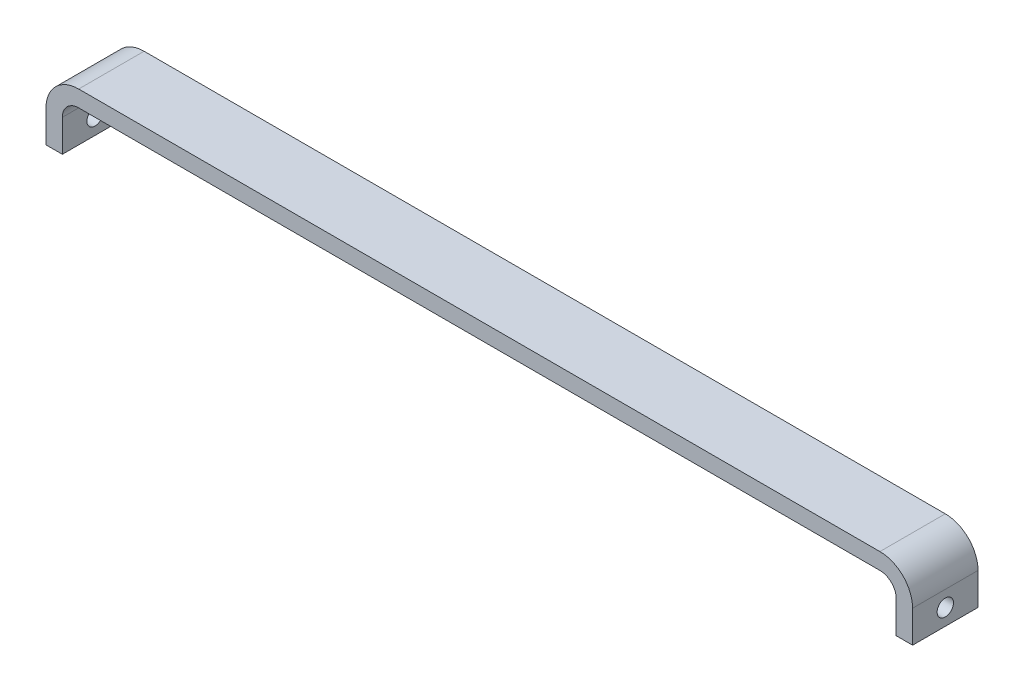
ISO-10303-21;
HEADER;
FILE_DESCRIPTION(('STEP AP214'),'2;1');
FILE_NAME('part.step','',(''),(''),'','','');
FILE_SCHEMA(('AUTOMOTIVE_DESIGN { 1 0 10303 214 1 1 1 1 }'));
ENDSEC;
DATA;
#1=APPLICATION_CONTEXT('core data for automotive mechanical design processes');
#2=APPLICATION_PROTOCOL_DEFINITION('international standard','automotive_design',2000,#1);
#3=PRODUCT_CONTEXT('',#1,'mechanical');
#4=PRODUCT('Part','Part','',(#3));
#5=PRODUCT_RELATED_PRODUCT_CATEGORY('part','',(#4));
#6=PRODUCT_DEFINITION_FORMATION('','',#4);
#7=PRODUCT_DEFINITION_CONTEXT('part definition',#1,'design');
#8=PRODUCT_DEFINITION('design','',#6,#7);
#9=PRODUCT_DEFINITION_SHAPE('','',#8);
#10=(LENGTH_UNIT() NAMED_UNIT(*) SI_UNIT(.MILLI.,.METRE.));
#11=(NAMED_UNIT(*) PLANE_ANGLE_UNIT() SI_UNIT($,.RADIAN.));
#12=(NAMED_UNIT(*) SI_UNIT($,.STERADIAN.) SOLID_ANGLE_UNIT());
#13=UNCERTAINTY_MEASURE_WITH_UNIT(LENGTH_MEASURE(1.E-05),#10,'distance_accuracy_value','');
#14=(GEOMETRIC_REPRESENTATION_CONTEXT(3) GLOBAL_UNCERTAINTY_ASSIGNED_CONTEXT((#13)) GLOBAL_UNIT_ASSIGNED_CONTEXT((#10,
#11,#12)) REPRESENTATION_CONTEXT('',''));
#15=CARTESIAN_POINT('',(0.,0.,0.));
#16=DIRECTION('',(0.,0.,1.));
#17=DIRECTION('',(1.,0.,0.));
#18=AXIS2_PLACEMENT_3D('',#15,#16,#17);
#19=CARTESIAN_POINT('',(0.,29.6,40.));
#20=DIRECTION('',(0.,1.,0.));
#21=DIRECTION('',(0.,0.,1.));
#22=AXIS2_PLACEMENT_3D('',#19,#20,#21);
#23=PLANE('',#22);
#24=DIRECTION('',(1.,0.,0.));
#25=VECTOR('',#24,1.);
#26=CARTESIAN_POINT('',(0.,29.6,0.));
#27=LINE('',#26,#25);
#28=CARTESIAN_POINT('',(20.,29.6,0.));
#29=VERTEX_POINT('',#28);
#30=CARTESIAN_POINT('',(510.,29.6,0.));
#31=VERTEX_POINT('',#30);
#32=EDGE_CURVE('E164',#29,#31,#27,.T.);
#33=ORIENTED_EDGE('',*,*,#32,.T.);
#34=DIRECTION('',(0.,0.,-1.));
#35=VECTOR('',#34,1.);
#36=CARTESIAN_POINT('',(510.,29.6,40.));
#37=LINE('',#36,#35);
#38=CARTESIAN_POINT('',(510.,29.6,40.));
#39=VERTEX_POINT('',#38);
#40=EDGE_CURVE('E11',#39,#31,#37,.T.);
#41=ORIENTED_EDGE('',*,*,#40,.F.);
#42=DIRECTION('',(1.,0.,0.));
#43=VECTOR('',#42,1.);
#44=CARTESIAN_POINT('',(0.,29.6,40.));
#45=LINE('',#44,#43);
#46=CARTESIAN_POINT('',(20.,29.6,40.));
#47=VERTEX_POINT('',#46);
#48=EDGE_CURVE('E194',#47,#39,#45,.T.);
#49=ORIENTED_EDGE('',*,*,#48,.F.);
#50=DIRECTION('',(0.,0.,-1.));
#51=VECTOR('',#50,1.);
#52=CARTESIAN_POINT('',(20.,29.6,40.));
#53=LINE('',#52,#51);
#54=EDGE_CURVE('E60',#47,#29,#53,.T.);
#55=ORIENTED_EDGE('',*,*,#54,.T.);
#56=EDGE_LOOP('',(#33,#41,#49,#55));
#57=FACE_BOUND('',#56,.T.);
#58=ADVANCED_FACE('F43',(#57),#23,.F.);
#59=CARTESIAN_POINT('',(510.,19.6,40.));
#60=DIRECTION('',(0.,0.,-1.));
#61=DIRECTION('',(-1.,0.,0.));
#62=AXIS2_PLACEMENT_3D('',#59,#60,#61);
#63=CYLINDRICAL_SURFACE('',#62,10.);
#64=CARTESIAN_POINT('',(510.,19.6,0.));
#65=DIRECTION('',(0.,0.,1.));
#66=DIRECTION('',(1.,0.,0.));
#67=AXIS2_PLACEMENT_3D('',#64,#65,#66);
#68=CIRCLE('',#67,10.);
#69=CARTESIAN_POINT('',(520.,19.6,0.));
#70=VERTEX_POINT('',#69);
#71=EDGE_CURVE('E166',#31,#70,#68,.F.);
#72=ORIENTED_EDGE('',*,*,#71,.T.);
#73=DIRECTION('',(0.,0.,-1.));
#74=VECTOR('',#73,1.);
#75=CARTESIAN_POINT('',(520.,19.6,40.));
#76=LINE('',#75,#74);
#77=CARTESIAN_POINT('',(520.,19.6,40.));
#78=VERTEX_POINT('',#77);
#79=EDGE_CURVE('E52',#78,#70,#76,.T.);
#80=ORIENTED_EDGE('',*,*,#79,.F.);
#81=CARTESIAN_POINT('',(510.,19.6,40.));
#82=DIRECTION('',(0.,0.,1.));
#83=DIRECTION('',(1.,0.,0.));
#84=AXIS2_PLACEMENT_3D('',#81,#82,#83);
#85=CIRCLE('',#84,10.);
#86=EDGE_CURVE('E110',#39,#78,#85,.F.);
#87=ORIENTED_EDGE('',*,*,#86,.F.);
#88=ORIENTED_EDGE('',*,*,#40,.T.);
#89=EDGE_LOOP('',(#72,#80,#87,#88));
#90=FACE_BOUND('',#89,.T.);
#91=ADVANCED_FACE('F263',(#90),#63,.F.);
#92=CARTESIAN_POINT('',(520.,0.,40.));
#93=DIRECTION('',(1.,0.,0.));
#94=DIRECTION('',(0.,0.,-1.));
#95=AXIS2_PLACEMENT_3D('',#92,#93,#94);
#96=PLANE('',#95);
#97=CARTESIAN_POINT('',(520.,10.,20.));
#98=DIRECTION('',(1.,0.,0.));
#99=DIRECTION('',(0.,0.,-1.));
#100=AXIS2_PLACEMENT_3D('',#97,#98,#99);
#101=CIRCLE('',#100,5.);
#102=CARTESIAN_POINT('',(520.,10.,15.));
#103=VERTEX_POINT('',#102);
#104=EDGE_CURVE('E167',#103,#103,#101,.T.);
#105=ORIENTED_EDGE('',*,*,#104,.T.);
#106=EDGE_LOOP('',(#105));
#107=FACE_BOUND('',#106,.T.);
#108=DIRECTION('',(0.,-1.,0.));
#109=VECTOR('',#108,1.);
#110=CARTESIAN_POINT('',(520.,0.,0.));
#111=LINE('',#110,#109);
#112=CARTESIAN_POINT('',(520.,0.,0.));
#113=VERTEX_POINT('',#112);
#114=EDGE_CURVE('E169',#70,#113,#111,.T.);
#115=ORIENTED_EDGE('',*,*,#114,.T.);
#116=DIRECTION('',(0.,0.,-1.));
#117=VECTOR('',#116,1.);
#118=CARTESIAN_POINT('',(520.,0.,40.));
#119=LINE('',#118,#117);
#120=CARTESIAN_POINT('',(520.,0.,40.));
#121=VERTEX_POINT('',#120);
#122=EDGE_CURVE('E209',#121,#113,#119,.T.);
#123=ORIENTED_EDGE('',*,*,#122,.F.);
#124=DIRECTION('',(0.,-1.,0.));
#125=VECTOR('',#124,1.);
#126=CARTESIAN_POINT('',(520.,0.,40.));
#127=LINE('',#126,#125);
#128=EDGE_CURVE('E218',#78,#121,#127,.T.);
#129=ORIENTED_EDGE('',*,*,#128,.F.);
#130=ORIENTED_EDGE('',*,*,#79,.T.);
#131=EDGE_LOOP('',(#115,#123,#129,#130));
#132=FACE_BOUND('',#131,.T.);
#133=ADVANCED_FACE('F216',(#107,#132),#96,.F.);
#134=CARTESIAN_POINT('',(0.,0.,40.));
#135=DIRECTION('',(0.,1.,0.));
#136=DIRECTION('',(0.,0.,1.));
#137=AXIS2_PLACEMENT_3D('',#134,#135,#136);
#138=PLANE('',#137);
#139=DIRECTION('',(1.,0.,0.));
#140=VECTOR('',#139,1.);
#141=CARTESIAN_POINT('',(0.,0.,0.));
#142=LINE('',#141,#140);
#143=CARTESIAN_POINT('',(530.,0.,0.));
#144=VERTEX_POINT('',#143);
#145=EDGE_CURVE('E171',#113,#144,#142,.T.);
#146=ORIENTED_EDGE('',*,*,#145,.T.);
#147=DIRECTION('',(0.,0.,-1.));
#148=VECTOR('',#147,1.);
#149=CARTESIAN_POINT('',(530.,0.,40.));
#150=LINE('',#149,#148);
#151=CARTESIAN_POINT('',(530.,0.,40.));
#152=VERTEX_POINT('',#151);
#153=EDGE_CURVE('E206',#152,#144,#150,.T.);
#154=ORIENTED_EDGE('',*,*,#153,.F.);
#155=DIRECTION('',(1.,0.,0.));
#156=VECTOR('',#155,1.);
#157=CARTESIAN_POINT('',(0.,0.,40.));
#158=LINE('',#157,#156);
#159=EDGE_CURVE('E235',#121,#152,#158,.T.);
#160=ORIENTED_EDGE('',*,*,#159,.F.);
#161=ORIENTED_EDGE('',*,*,#122,.T.);
#162=EDGE_LOOP('',(#146,#154,#160,#161));
#163=FACE_BOUND('',#162,.T.);
#164=ADVANCED_FACE('F225',(#163),#138,.F.);
#165=CARTESIAN_POINT('',(530.,0.,40.));
#166=DIRECTION('',(-1.,0.,0.));
#167=DIRECTION('',(0.,0.,1.));
#168=AXIS2_PLACEMENT_3D('',#165,#166,#167);
#169=PLANE('',#168);
#170=CARTESIAN_POINT('',(530.,10.,20.));
#171=DIRECTION('',(-1.,0.,0.));
#172=DIRECTION('',(0.,0.,1.));
#173=AXIS2_PLACEMENT_3D('',#170,#171,#172);
#174=CIRCLE('',#173,5.);
#175=CARTESIAN_POINT('',(530.,10.,25.));
#176=VERTEX_POINT('',#175);
#177=EDGE_CURVE('E276',#176,#176,#174,.T.);
#178=ORIENTED_EDGE('',*,*,#177,.T.);
#179=EDGE_LOOP('',(#178));
#180=FACE_BOUND('',#179,.T.);
#181=DIRECTION('',(0.,1.,0.));
#182=VECTOR('',#181,1.);
#183=CARTESIAN_POINT('',(530.,0.,0.));
#184=LINE('',#183,#182);
#185=CARTESIAN_POINT('',(530.,19.6,0.));
#186=VERTEX_POINT('',#185);
#187=EDGE_CURVE('E173',#144,#186,#184,.T.);
#188=ORIENTED_EDGE('',*,*,#187,.T.);
#189=DIRECTION('',(0.,0.,-1.));
#190=VECTOR('',#189,1.);
#191=CARTESIAN_POINT('',(530.,19.6,40.));
#192=LINE('',#191,#190);
#193=CARTESIAN_POINT('',(530.,19.6,40.));
#194=VERTEX_POINT('',#193);
#195=EDGE_CURVE('E204',#194,#186,#192,.T.);
#196=ORIENTED_EDGE('',*,*,#195,.F.);
#197=DIRECTION('',(0.,1.,0.));
#198=VECTOR('',#197,1.);
#199=CARTESIAN_POINT('',(530.,0.,40.));
#200=LINE('',#199,#198);
#201=EDGE_CURVE('E231',#152,#194,#200,.T.);
#202=ORIENTED_EDGE('',*,*,#201,.F.);
#203=ORIENTED_EDGE('',*,*,#153,.T.);
#204=EDGE_LOOP('',(#188,#196,#202,#203));
#205=FACE_BOUND('',#204,.T.);
#206=ADVANCED_FACE('F229',(#180,#205),#169,.F.);
#207=CARTESIAN_POINT('',(510.,19.6,40.));
#208=DIRECTION('',(0.,0.,-1.));
#209=DIRECTION('',(-1.,0.,0.));
#210=AXIS2_PLACEMENT_3D('',#207,#208,#209);
#211=CYLINDRICAL_SURFACE('',#210,20.);
#212=CARTESIAN_POINT('',(510.,19.6,0.));
#213=DIRECTION('',(0.,0.,1.));
#214=DIRECTION('',(1.,0.,0.));
#215=AXIS2_PLACEMENT_3D('',#212,#213,#214);
#216=CIRCLE('',#215,20.);
#217=CARTESIAN_POINT('',(510.,39.6,0.));
#218=VERTEX_POINT('',#217);
#219=EDGE_CURVE('E176',#218,#186,#216,.F.);
#220=ORIENTED_EDGE('',*,*,#219,.F.);
#221=DIRECTION('',(0.,0.,-1.));
#222=VECTOR('',#221,1.);
#223=CARTESIAN_POINT('',(510.,39.6,40.));
#224=LINE('',#223,#222);
#225=CARTESIAN_POINT('',(510.,39.6,40.));
#226=VERTEX_POINT('',#225);
#227=EDGE_CURVE('E202',#226,#218,#224,.T.);
#228=ORIENTED_EDGE('',*,*,#227,.F.);
#229=CARTESIAN_POINT('',(510.,19.6,40.));
#230=DIRECTION('',(0.,0.,1.));
#231=DIRECTION('',(1.,0.,0.));
#232=AXIS2_PLACEMENT_3D('',#229,#230,#231);
#233=CIRCLE('',#232,20.);
#234=EDGE_CURVE('E234',#226,#194,#233,.F.);
#235=ORIENTED_EDGE('',*,*,#234,.T.);
#236=ORIENTED_EDGE('',*,*,#195,.T.);
#237=EDGE_LOOP('',(#220,#228,#235,#236));
#238=FACE_BOUND('',#237,.T.);
#239=ADVANCED_FACE('F304',(#238),#211,.T.);
#240=CARTESIAN_POINT('',(0.,39.6,40.));
#241=DIRECTION('',(0.,1.,0.));
#242=DIRECTION('',(0.,0.,1.));
#243=AXIS2_PLACEMENT_3D('',#240,#241,#242);
#244=PLANE('',#243);
#245=DIRECTION('',(1.,0.,0.));
#246=VECTOR('',#245,1.);
#247=CARTESIAN_POINT('',(0.,39.6,0.));
#248=LINE('',#247,#246);
#249=CARTESIAN_POINT('',(20.,39.6,0.));
#250=VERTEX_POINT('',#249);
#251=EDGE_CURVE('E179',#250,#218,#248,.T.);
#252=ORIENTED_EDGE('',*,*,#251,.F.);
#253=DIRECTION('',(0.,0.,-1.));
#254=VECTOR('',#253,1.);
#255=CARTESIAN_POINT('',(20.,39.6,40.));
#256=LINE('',#255,#254);
#257=CARTESIAN_POINT('',(20.,39.6,40.));
#258=VERTEX_POINT('',#257);
#259=EDGE_CURVE('E200',#258,#250,#256,.T.);
#260=ORIENTED_EDGE('',*,*,#259,.F.);
#261=DIRECTION('',(1.,0.,0.));
#262=VECTOR('',#261,1.);
#263=CARTESIAN_POINT('',(0.,39.6,40.));
#264=LINE('',#263,#262);
#265=EDGE_CURVE('E237',#258,#226,#264,.T.);
#266=ORIENTED_EDGE('',*,*,#265,.T.);
#267=ORIENTED_EDGE('',*,*,#227,.T.);
#268=EDGE_LOOP('',(#252,#260,#266,#267));
#269=FACE_BOUND('',#268,.T.);
#270=ADVANCED_FACE('F298',(#269),#244,.T.);
#271=CARTESIAN_POINT('',(20.,19.6,40.));
#272=DIRECTION('',(0.,0.,-1.));
#273=DIRECTION('',(-1.,0.,0.));
#274=AXIS2_PLACEMENT_3D('',#271,#272,#273);
#275=CYLINDRICAL_SURFACE('',#274,20.);
#276=CARTESIAN_POINT('',(20.,19.6,0.));
#277=DIRECTION('',(0.,0.,1.));
#278=DIRECTION('',(1.,0.,0.));
#279=AXIS2_PLACEMENT_3D('',#276,#277,#278);
#280=CIRCLE('',#279,20.);
#281=CARTESIAN_POINT('',(0.,19.6,0.));
#282=VERTEX_POINT('',#281);
#283=EDGE_CURVE('E182',#250,#282,#280,.T.);
#284=ORIENTED_EDGE('',*,*,#283,.T.);
#285=DIRECTION('',(0.,0.,-1.));
#286=VECTOR('',#285,1.);
#287=CARTESIAN_POINT('',(0.,19.6,40.));
#288=LINE('',#287,#286);
#289=CARTESIAN_POINT('',(0.,19.6,40.));
#290=VERTEX_POINT('',#289);
#291=EDGE_CURVE('E198',#290,#282,#288,.T.);
#292=ORIENTED_EDGE('',*,*,#291,.F.);
#293=CARTESIAN_POINT('',(20.,19.6,40.));
#294=DIRECTION('',(0.,0.,1.));
#295=DIRECTION('',(1.,0.,0.));
#296=AXIS2_PLACEMENT_3D('',#293,#294,#295);
#297=CIRCLE('',#296,20.);
#298=EDGE_CURVE('E244',#258,#290,#297,.T.);
#299=ORIENTED_EDGE('',*,*,#298,.F.);
#300=ORIENTED_EDGE('',*,*,#259,.T.);
#301=EDGE_LOOP('',(#284,#292,#299,#300));
#302=FACE_BOUND('',#301,.T.);
#303=ADVANCED_FACE('F291',(#302),#275,.T.);
#304=CARTESIAN_POINT('',(0.,0.,40.));
#305=DIRECTION('',(-1.,0.,0.));
#306=DIRECTION('',(0.,0.,1.));
#307=AXIS2_PLACEMENT_3D('',#304,#305,#306);
#308=PLANE('',#307);
#309=CARTESIAN_POINT('',(0.,10.,20.));
#310=DIRECTION('',(-1.,0.,0.));
#311=DIRECTION('',(0.,0.,1.));
#312=AXIS2_PLACEMENT_3D('',#309,#310,#311);
#313=CIRCLE('',#312,5.);
#314=CARTESIAN_POINT('',(0.,10.,25.));
#315=VERTEX_POINT('',#314);
#316=EDGE_CURVE('E273',#315,#315,#313,.T.);
#317=ORIENTED_EDGE('',*,*,#316,.F.);
#318=EDGE_LOOP('',(#317));
#319=FACE_BOUND('',#318,.T.);
#320=DIRECTION('',(0.,1.,0.));
#321=VECTOR('',#320,1.);
#322=CARTESIAN_POINT('',(0.,0.,0.));
#323=LINE('',#322,#321);
#324=CARTESIAN_POINT('',(0.,0.,0.));
#325=VERTEX_POINT('',#324);
#326=EDGE_CURVE('E185',#325,#282,#323,.T.);
#327=ORIENTED_EDGE('',*,*,#326,.F.);
#328=DIRECTION('',(0.,0.,-1.));
#329=VECTOR('',#328,1.);
#330=CARTESIAN_POINT('',(0.,0.,40.));
#331=LINE('',#330,#329);
#332=CARTESIAN_POINT('',(0.,0.,40.));
#333=VERTEX_POINT('',#332);
#334=EDGE_CURVE('E156',#333,#325,#331,.T.);
#335=ORIENTED_EDGE('',*,*,#334,.F.);
#336=DIRECTION('',(0.,1.,0.));
#337=VECTOR('',#336,1.);
#338=CARTESIAN_POINT('',(0.,0.,40.));
#339=LINE('',#338,#337);
#340=EDGE_CURVE('E146',#333,#290,#339,.T.);
#341=ORIENTED_EDGE('',*,*,#340,.T.);
#342=ORIENTED_EDGE('',*,*,#291,.T.);
#343=EDGE_LOOP('',(#327,#335,#341,#342));
#344=FACE_BOUND('',#343,.T.);
#345=ADVANCED_FACE('F247',(#319,#344),#308,.T.);
#346=CARTESIAN_POINT('',(0.,0.,40.));
#347=DIRECTION('',(0.,1.,0.));
#348=DIRECTION('',(0.,0.,1.));
#349=AXIS2_PLACEMENT_3D('',#346,#347,#348);
#350=PLANE('',#349);
#351=DIRECTION('',(1.,0.,0.));
#352=VECTOR('',#351,1.);
#353=CARTESIAN_POINT('',(0.,0.,0.));
#354=LINE('',#353,#352);
#355=CARTESIAN_POINT('',(10.,0.,0.));
#356=VERTEX_POINT('',#355);
#357=EDGE_CURVE('E153',#325,#356,#354,.T.);
#358=ORIENTED_EDGE('',*,*,#357,.T.);
#359=DIRECTION('',(0.,0.,-1.));
#360=VECTOR('',#359,1.);
#361=CARTESIAN_POINT('',(10.,0.,40.));
#362=LINE('',#361,#360);
#363=CARTESIAN_POINT('',(10.,0.,40.));
#364=VERTEX_POINT('',#363);
#365=EDGE_CURVE('E150',#364,#356,#362,.T.);
#366=ORIENTED_EDGE('',*,*,#365,.F.);
#367=DIRECTION('',(1.,0.,0.));
#368=VECTOR('',#367,1.);
#369=CARTESIAN_POINT('',(0.,0.,40.));
#370=LINE('',#369,#368);
#371=EDGE_CURVE('E139',#333,#364,#370,.T.);
#372=ORIENTED_EDGE('',*,*,#371,.F.);
#373=ORIENTED_EDGE('',*,*,#334,.T.);
#374=EDGE_LOOP('',(#358,#366,#372,#373));
#375=FACE_BOUND('',#374,.T.);
#376=ADVANCED_FACE('F151',(#375),#350,.F.);
#377=CARTESIAN_POINT('',(10.,0.,40.));
#378=DIRECTION('',(1.,0.,0.));
#379=DIRECTION('',(0.,0.,-1.));
#380=AXIS2_PLACEMENT_3D('',#377,#378,#379);
#381=PLANE('',#380);
#382=CARTESIAN_POINT('',(10.,10.,20.));
#383=DIRECTION('',(1.,0.,0.));
#384=DIRECTION('',(0.,0.,-1.));
#385=AXIS2_PLACEMENT_3D('',#382,#383,#384);
#386=CIRCLE('',#385,5.);
#387=CARTESIAN_POINT('',(10.,10.,15.));
#388=VERTEX_POINT('',#387);
#389=EDGE_CURVE('E46',#388,#388,#386,.T.);
#390=ORIENTED_EDGE('',*,*,#389,.F.);
#391=EDGE_LOOP('',(#390));
#392=FACE_BOUND('',#391,.T.);
#393=DIRECTION('',(0.,-1.,0.));
#394=VECTOR('',#393,1.);
#395=CARTESIAN_POINT('',(10.,0.,0.));
#396=LINE('',#395,#394);
#397=CARTESIAN_POINT('',(10.,19.6,0.));
#398=VERTEX_POINT('',#397);
#399=EDGE_CURVE('E189',#398,#356,#396,.T.);
#400=ORIENTED_EDGE('',*,*,#399,.F.);
#401=DIRECTION('',(0.,0.,-1.));
#402=VECTOR('',#401,1.);
#403=CARTESIAN_POINT('',(10.,19.6,40.));
#404=LINE('',#403,#402);
#405=CARTESIAN_POINT('',(10.,19.6,40.));
#406=VERTEX_POINT('',#405);
#407=EDGE_CURVE('E98',#406,#398,#404,.T.);
#408=ORIENTED_EDGE('',*,*,#407,.F.);
#409=DIRECTION('',(0.,-1.,0.));
#410=VECTOR('',#409,1.);
#411=CARTESIAN_POINT('',(10.,0.,40.));
#412=LINE('',#411,#410);
#413=EDGE_CURVE('E144',#406,#364,#412,.T.);
#414=ORIENTED_EDGE('',*,*,#413,.T.);
#415=ORIENTED_EDGE('',*,*,#365,.T.);
#416=EDGE_LOOP('',(#400,#408,#414,#415));
#417=FACE_BOUND('',#416,.T.);
#418=ADVANCED_FACE('F158',(#392,#417),#381,.T.);
#419=CARTESIAN_POINT('',(20.,19.6,40.));
#420=DIRECTION('',(0.,0.,-1.));
#421=DIRECTION('',(-1.,0.,0.));
#422=AXIS2_PLACEMENT_3D('',#419,#420,#421);
#423=CYLINDRICAL_SURFACE('',#422,10.);
#424=CARTESIAN_POINT('',(20.,19.6,0.));
#425=DIRECTION('',(0.,0.,1.));
#426=DIRECTION('',(1.,0.,0.));
#427=AXIS2_PLACEMENT_3D('',#424,#425,#426);
#428=CIRCLE('',#427,10.);
#429=EDGE_CURVE('E191',#29,#398,#428,.T.);
#430=ORIENTED_EDGE('',*,*,#429,.F.);
#431=ORIENTED_EDGE('',*,*,#54,.F.);
#432=CARTESIAN_POINT('',(20.,19.6,40.));
#433=DIRECTION('',(0.,0.,1.));
#434=DIRECTION('',(1.,0.,0.));
#435=AXIS2_PLACEMENT_3D('',#432,#433,#434);
#436=CIRCLE('',#435,10.);
#437=EDGE_CURVE('E159',#47,#406,#436,.T.);
#438=ORIENTED_EDGE('',*,*,#437,.T.);
#439=ORIENTED_EDGE('',*,*,#407,.T.);
#440=EDGE_LOOP('',(#430,#431,#438,#439));
#441=FACE_BOUND('',#440,.T.);
#442=ADVANCED_FACE('F250',(#441),#423,.F.);
#443=CARTESIAN_POINT('',(0.,0.,40.));
#444=DIRECTION('',(0.,0.,1.));
#445=DIRECTION('',(1.,0.,0.));
#446=AXIS2_PLACEMENT_3D('',#443,#444,#445);
#447=PLANE('',#446);
#448=ORIENTED_EDGE('',*,*,#48,.T.);
#449=ORIENTED_EDGE('',*,*,#86,.T.);
#450=ORIENTED_EDGE('',*,*,#128,.T.);
#451=ORIENTED_EDGE('',*,*,#159,.T.);
#452=ORIENTED_EDGE('',*,*,#201,.T.);
#453=ORIENTED_EDGE('',*,*,#234,.F.);
#454=ORIENTED_EDGE('',*,*,#265,.F.);
#455=ORIENTED_EDGE('',*,*,#298,.T.);
#456=ORIENTED_EDGE('',*,*,#340,.F.);
#457=ORIENTED_EDGE('',*,*,#371,.T.);
#458=ORIENTED_EDGE('',*,*,#413,.F.);
#459=ORIENTED_EDGE('',*,*,#437,.F.);
#460=EDGE_LOOP('',(#448,#449,#450,#451,#452,#453,#454,#455,#456,#457,#458,#459));
#461=FACE_BOUND('',#460,.T.);
#462=ADVANCED_FACE('F141',(#461),#447,.T.);
#463=CARTESIAN_POINT('',(0.,0.,0.));
#464=DIRECTION('',(0.,0.,1.));
#465=DIRECTION('',(1.,0.,0.));
#466=AXIS2_PLACEMENT_3D('',#463,#464,#465);
#467=PLANE('',#466);
#468=ORIENTED_EDGE('',*,*,#32,.F.);
#469=ORIENTED_EDGE('',*,*,#429,.T.);
#470=ORIENTED_EDGE('',*,*,#399,.T.);
#471=ORIENTED_EDGE('',*,*,#357,.F.);
#472=ORIENTED_EDGE('',*,*,#326,.T.);
#473=ORIENTED_EDGE('',*,*,#283,.F.);
#474=ORIENTED_EDGE('',*,*,#251,.T.);
#475=ORIENTED_EDGE('',*,*,#219,.T.);
#476=ORIENTED_EDGE('',*,*,#187,.F.);
#477=ORIENTED_EDGE('',*,*,#145,.F.);
#478=ORIENTED_EDGE('',*,*,#114,.F.);
#479=ORIENTED_EDGE('',*,*,#71,.F.);
#480=EDGE_LOOP('',(#468,#469,#470,#471,#472,#473,#474,#475,#476,#477,#478,#479));
#481=FACE_BOUND('',#480,.T.);
#482=ADVANCED_FACE('F221',(#481),#467,.F.);
#483=CARTESIAN_POINT('',(530.,10.,20.));
#484=DIRECTION('',(-1.,0.,0.));
#485=DIRECTION('',(0.,0.,1.));
#486=AXIS2_PLACEMENT_3D('',#483,#484,#485);
#487=CYLINDRICAL_SURFACE('',#486,5.);
#488=ORIENTED_EDGE('',*,*,#389,.T.);
#489=EDGE_LOOP('',(#488));
#490=FACE_BOUND('',#489,.T.);
#491=ORIENTED_EDGE('',*,*,#316,.T.);
#492=EDGE_LOOP('',(#491));
#493=FACE_BOUND('',#492,.T.);
#494=ADVANCED_FACE('F283',(#490,#493),#487,.F.);
#495=ORIENTED_EDGE('',*,*,#177,.F.);
#496=EDGE_LOOP('',(#495));
#497=FACE_BOUND('',#496,.T.);
#498=ORIENTED_EDGE('',*,*,#104,.F.);
#499=EDGE_LOOP('',(#498));
#500=FACE_BOUND('',#499,.T.);
#501=ADVANCED_FACE('F286',(#497,#500),#487,.F.);
#502=CLOSED_SHELL('',(#58,#91,#133,#164,#206,#239,#270,#303,#345,#376,#418,#442,#462,#482,#494,#501));
#503=MANIFOLD_SOLID_BREP('B2',#502);
#504=ADVANCED_BREP_SHAPE_REPRESENTATION('',(#18,#503),#14);
#505=SHAPE_DEFINITION_REPRESENTATION(#9,#504);
ENDSEC;
END-ISO-10303-21;
